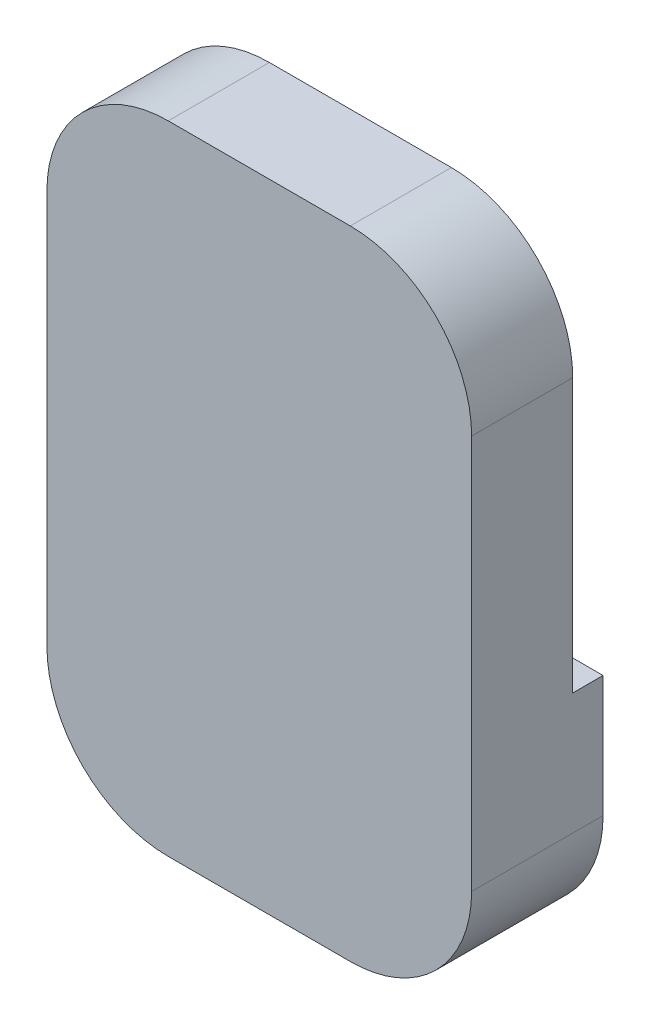
ISO-10303-21;
HEADER;
FILE_DESCRIPTION(('STEP AP214'),'2;1');
FILE_NAME('part.step','',(''),(''),'','','');
FILE_SCHEMA(('AUTOMOTIVE_DESIGN { 1 0 10303 214 1 1 1 1 }'));
ENDSEC;
DATA;
#1=APPLICATION_CONTEXT('core data for automotive mechanical design processes');
#2=APPLICATION_PROTOCOL_DEFINITION('international standard','automotive_design',2000,#1);
#3=PRODUCT_CONTEXT('',#1,'mechanical');
#4=PRODUCT('Part','Part','',(#3));
#5=PRODUCT_RELATED_PRODUCT_CATEGORY('part','',(#4));
#6=PRODUCT_DEFINITION_FORMATION('','',#4);
#7=PRODUCT_DEFINITION_CONTEXT('part definition',#1,'design');
#8=PRODUCT_DEFINITION('design','',#6,#7);
#9=PRODUCT_DEFINITION_SHAPE('','',#8);
#10=(LENGTH_UNIT() NAMED_UNIT(*) SI_UNIT(.MILLI.,.METRE.));
#11=(NAMED_UNIT(*) PLANE_ANGLE_UNIT() SI_UNIT($,.RADIAN.));
#12=(NAMED_UNIT(*) SI_UNIT($,.STERADIAN.) SOLID_ANGLE_UNIT());
#13=UNCERTAINTY_MEASURE_WITH_UNIT(LENGTH_MEASURE(1.E-05),#10,'distance_accuracy_value','');
#14=(GEOMETRIC_REPRESENTATION_CONTEXT(3) GLOBAL_UNCERTAINTY_ASSIGNED_CONTEXT((#13)) GLOBAL_UNIT_ASSIGNED_CONTEXT((#10,
#11,#12)) REPRESENTATION_CONTEXT('',''));
#15=CARTESIAN_POINT('',(0.,0.,0.));
#16=DIRECTION('',(0.,0.,1.));
#17=DIRECTION('',(1.,0.,0.));
#18=AXIS2_PLACEMENT_3D('',#15,#16,#17);
#19=CARTESIAN_POINT('',(-21.,31.5,10.));
#20=DIRECTION('',(1.,0.,0.));
#21=DIRECTION('',(0.,1.,0.));
#22=AXIS2_PLACEMENT_3D('',#19,#20,#21);
#23=PLANE('',#22);
#24=DIRECTION('',(0.,1.,0.));
#25=VECTOR('',#24,1.);
#26=CARTESIAN_POINT('',(-21.,0.,-3.));
#27=LINE('',#26,#25);
#28=CARTESIAN_POINT('',(-21.,-19.5,-3.));
#29=VERTEX_POINT('',#28);
#30=CARTESIAN_POINT('',(-21.,-7.50000000000001,-3.));
#31=VERTEX_POINT('',#30);
#32=EDGE_CURVE('E324',#29,#31,#27,.T.);
#33=ORIENTED_EDGE('',*,*,#32,.F.);
#34=DIRECTION('',(0.,0.,-1.));
#35=VECTOR('',#34,1.);
#36=CARTESIAN_POINT('',(-21.,-19.5,10.));
#37=LINE('',#36,#35);
#38=CARTESIAN_POINT('',(-21.,-19.5,10.));
#39=VERTEX_POINT('',#38);
#40=EDGE_CURVE('E445',#29,#39,#37,.F.);
#41=ORIENTED_EDGE('',*,*,#40,.T.);
#42=DIRECTION('',(0.,-1.,0.));
#43=VECTOR('',#42,1.);
#44=CARTESIAN_POINT('',(-21.,31.5,10.));
#45=LINE('',#44,#43);
#46=CARTESIAN_POINT('',(-21.,19.5,10.));
#47=VERTEX_POINT('',#46);
#48=EDGE_CURVE('E412',#47,#39,#45,.T.);
#49=ORIENTED_EDGE('',*,*,#48,.F.);
#50=DIRECTION('',(0.,0.,-1.));
#51=VECTOR('',#50,1.);
#52=CARTESIAN_POINT('',(-21.,19.5,10.));
#53=LINE('',#52,#51);
#54=CARTESIAN_POINT('',(-21.,19.5,0.));
#55=VERTEX_POINT('',#54);
#56=EDGE_CURVE('E442',#47,#55,#53,.T.);
#57=ORIENTED_EDGE('',*,*,#56,.T.);
#58=DIRECTION('',(0.,-1.,0.));
#59=VECTOR('',#58,1.);
#60=CARTESIAN_POINT('',(-21.,31.5,0.));
#61=LINE('',#60,#59);
#62=CARTESIAN_POINT('',(-21.,-7.50000000000001,0.));
#63=VERTEX_POINT('',#62);
#64=EDGE_CURVE('E409',#55,#63,#61,.T.);
#65=ORIENTED_EDGE('',*,*,#64,.T.);
#66=DIRECTION('',(0.,0.,1.));
#67=VECTOR('',#66,1.);
#68=CARTESIAN_POINT('',(-21.,-7.50000000000001,-10.));
#69=LINE('',#68,#67);
#70=EDGE_CURVE('E401',#31,#63,#69,.T.);
#71=ORIENTED_EDGE('',*,*,#70,.F.);
#72=EDGE_LOOP('',(#33,#41,#49,#57,#65,#71));
#73=FACE_BOUND('',#72,.T.);
#74=ADVANCED_FACE('F147',(#73),#23,.F.);
#75=CARTESIAN_POINT('',(21.,-7.50000000000001,-10.));
#76=DIRECTION('',(0.,-1.,0.));
#77=DIRECTION('',(0.,0.,-1.));
#78=AXIS2_PLACEMENT_3D('',#75,#76,#77);
#79=PLANE('',#78);
#80=CARTESIAN_POINT('',(-1.27,-7.50000000000001,-6.25));
#81=DIRECTION('',(0.,1.,0.));
#82=DIRECTION('',(0.,0.,1.));
#83=AXIS2_PLACEMENT_3D('',#80,#81,#82);
#84=CIRCLE('',#83,0.74);
#85=CARTESIAN_POINT('',(-1.27,-7.50000000000001,-5.51));
#86=VERTEX_POINT('',#85);
#87=EDGE_CURVE('E355',#86,#86,#84,.T.);
#88=ORIENTED_EDGE('',*,*,#87,.F.);
#89=EDGE_LOOP('',(#88));
#90=FACE_BOUND('',#89,.T.);
#91=CARTESIAN_POINT('',(3.81,-7.50000000000001,-6.25000000000002));
#92=DIRECTION('',(0.,1.,0.));
#93=DIRECTION('',(0.,0.,1.));
#94=AXIS2_PLACEMENT_3D('',#91,#92,#93);
#95=CIRCLE('',#94,0.74);
#96=CARTESIAN_POINT('',(3.81,-7.50000000000001,-5.51000000000002));
#97=VERTEX_POINT('',#96);
#98=EDGE_CURVE('E349',#97,#97,#95,.T.);
#99=ORIENTED_EDGE('',*,*,#98,.F.);
#100=EDGE_LOOP('',(#99));
#101=FACE_BOUND('',#100,.T.);
#102=CARTESIAN_POINT('',(1.27,-7.50000000000001,-6.25000000000002));
#103=DIRECTION('',(0.,1.,0.));
#104=DIRECTION('',(0.,0.,1.));
#105=AXIS2_PLACEMENT_3D('',#102,#103,#104);
#106=CIRCLE('',#105,0.74);
#107=CARTESIAN_POINT('',(1.27,-7.50000000000001,-5.51000000000002));
#108=VERTEX_POINT('',#107);
#109=EDGE_CURVE('E343',#108,#108,#106,.T.);
#110=ORIENTED_EDGE('',*,*,#109,.F.);
#111=EDGE_LOOP('',(#110));
#112=FACE_BOUND('',#111,.T.);
#113=CARTESIAN_POINT('',(-3.81,-7.50000000000001,-6.24999999999998));
#114=DIRECTION('',(0.,1.,0.));
#115=DIRECTION('',(0.,0.,1.));
#116=AXIS2_PLACEMENT_3D('',#113,#114,#115);
#117=CIRCLE('',#116,0.74);
#118=CARTESIAN_POINT('',(-3.81,-7.50000000000001,-5.50999999999998));
#119=VERTEX_POINT('',#118);
#120=EDGE_CURVE('E340',#119,#119,#117,.T.);
#121=ORIENTED_EDGE('',*,*,#120,.F.);
#122=EDGE_LOOP('',(#121));
#123=FACE_BOUND('',#122,.T.);
#124=DIRECTION('',(0.,0.,-1.));
#125=VECTOR('',#124,1.);
#126=CARTESIAN_POINT('',(-6.55000000000001,-7.50000000000001,-3.));
#127=LINE('',#126,#125);
#128=CARTESIAN_POINT('',(-6.55000000000001,-7.50000000000001,-3.));
#129=VERTEX_POINT('',#128);
#130=CARTESIAN_POINT('',(-6.55000000000001,-7.50000000000001,-10.));
#131=VERTEX_POINT('',#130);
#132=EDGE_CURVE('E317',#129,#131,#127,.T.);
#133=ORIENTED_EDGE('',*,*,#132,.F.);
#134=DIRECTION('',(1.,0.,0.));
#135=VECTOR('',#134,1.);
#136=CARTESIAN_POINT('',(0.,-7.50000000000001,-3.));
#137=LINE('',#136,#135);
#138=EDGE_CURVE('E316',#31,#129,#137,.T.);
#139=ORIENTED_EDGE('',*,*,#138,.F.);
#140=ORIENTED_EDGE('',*,*,#70,.T.);
#141=DIRECTION('',(1.,0.,0.));
#142=VECTOR('',#141,1.);
#143=CARTESIAN_POINT('',(21.,-7.50000000000001,0.));
#144=LINE('',#143,#142);
#145=CARTESIAN_POINT('',(-3.5,-7.50000000000001,0.));
#146=VERTEX_POINT('',#145);
#147=EDGE_CURVE('E395',#63,#146,#144,.T.);
#148=ORIENTED_EDGE('',*,*,#147,.T.);
#149=DIRECTION('',(0.55470019622523,0.,0.832050294337843));
#150=VECTOR('',#149,1.);
#151=CARTESIAN_POINT('',(-2.42307692307692,-7.50000000000001,1.61538461538461));
#152=LINE('',#151,#150);
#153=CARTESIAN_POINT('',(-5.5,-7.50000000000001,-3.));
#154=VERTEX_POINT('',#153);
#155=EDGE_CURVE('E364',#154,#146,#152,.T.);
#156=ORIENTED_EDGE('',*,*,#155,.F.);
#157=DIRECTION('',(-1.,0.,0.));
#158=VECTOR('',#157,1.);
#159=CARTESIAN_POINT('',(0.,-7.50000000000001,-3.));
#160=LINE('',#159,#158);
#161=CARTESIAN_POINT('',(5.5,-7.50000000000001,-3.));
#162=VERTEX_POINT('',#161);
#163=EDGE_CURVE('E374',#162,#154,#160,.T.);
#164=ORIENTED_EDGE('',*,*,#163,.F.);
#165=DIRECTION('',(-0.554700196225229,0.,0.832050294337844));
#166=VECTOR('',#165,1.);
#167=CARTESIAN_POINT('',(2.42307692307692,-7.50000000000001,1.61538461538461));
#168=LINE('',#167,#166);
#169=CARTESIAN_POINT('',(3.5,-7.50000000000001,0.));
#170=VERTEX_POINT('',#169);
#171=EDGE_CURVE('E339',#162,#170,#168,.T.);
#172=ORIENTED_EDGE('',*,*,#171,.T.);
#173=CARTESIAN_POINT('',(21.,-7.50000000000001,0.));
#174=VERTEX_POINT('',#173);
#175=EDGE_CURVE('E390',#170,#174,#144,.T.);
#176=ORIENTED_EDGE('',*,*,#175,.T.);
#177=DIRECTION('',(0.,0.,1.));
#178=VECTOR('',#177,1.);
#179=CARTESIAN_POINT('',(21.,-7.50000000000001,-10.));
#180=LINE('',#179,#178);
#181=CARTESIAN_POINT('',(21.,-7.50000000000001,-3.));
#182=VERTEX_POINT('',#181);
#183=EDGE_CURVE('E398',#182,#174,#180,.T.);
#184=ORIENTED_EDGE('',*,*,#183,.F.);
#185=CARTESIAN_POINT('',(6.55000000000001,-7.50000000000001,-3.));
#186=VERTEX_POINT('',#185);
#187=EDGE_CURVE('E321',#186,#182,#137,.T.);
#188=ORIENTED_EDGE('',*,*,#187,.F.);
#189=DIRECTION('',(0.,0.,-1.));
#190=VECTOR('',#189,1.);
#191=CARTESIAN_POINT('',(6.55000000000001,-7.50000000000001,-3.));
#192=LINE('',#191,#190);
#193=CARTESIAN_POINT('',(6.55000000000001,-7.50000000000001,-10.));
#194=VERTEX_POINT('',#193);
#195=EDGE_CURVE('E526',#186,#194,#192,.T.);
#196=ORIENTED_EDGE('',*,*,#195,.T.);
#197=DIRECTION('',(1.,0.,0.));
#198=VECTOR('',#197,1.);
#199=CARTESIAN_POINT('',(21.,-7.50000000000001,-10.));
#200=LINE('',#199,#198);
#201=EDGE_CURVE('E394',#131,#194,#200,.T.);
#202=ORIENTED_EDGE('',*,*,#201,.F.);
#203=EDGE_LOOP('',(#133,#139,#140,#148,#156,#164,#172,#176,#184,#188,#196,#202));
#204=FACE_BOUND('',#203,.T.);
#205=ADVANCED_FACE('F569',(#90,#101,#112,#123,#204),#79,.F.);
#206=CARTESIAN_POINT('',(0.,0.,-10.));
#207=DIRECTION('',(0.,0.,1.));
#208=DIRECTION('',(1.,0.,0.));
#209=AXIS2_PLACEMENT_3D('',#206,#207,#208);
#210=PLANE('',#209);
#211=DIRECTION('',(-1.,0.,0.));
#212=VECTOR('',#211,1.);
#213=CARTESIAN_POINT('',(0.,-23.5,-10.));
#214=LINE('',#213,#212);
#215=CARTESIAN_POINT('',(7.55000000000001,-23.5,-10.));
#216=VERTEX_POINT('',#215);
#217=CARTESIAN_POINT('',(-7.55000000000001,-23.5,-10.));
#218=VERTEX_POINT('',#217);
#219=EDGE_CURVE('E332',#216,#218,#214,.T.);
#220=ORIENTED_EDGE('',*,*,#219,.T.);
#221=DIRECTION('',(-0.0623782861551805,-0.998052578482889,0.));
#222=VECTOR('',#221,1.);
#223=CARTESIAN_POINT('',(-6.55000000000001,-7.50000000000001,-10.));
#224=LINE('',#223,#222);
#225=EDGE_CURVE('E302',#131,#218,#224,.T.);
#226=ORIENTED_EDGE('',*,*,#225,.F.);
#227=ORIENTED_EDGE('',*,*,#201,.T.);
#228=DIRECTION('',(0.0623782861551805,-0.998052578482889,0.));
#229=VECTOR('',#228,1.);
#230=CARTESIAN_POINT('',(6.55000000000001,-7.50000000000001,-10.));
#231=LINE('',#230,#229);
#232=EDGE_CURVE('E530',#194,#216,#231,.T.);
#233=ORIENTED_EDGE('',*,*,#232,.T.);
#234=EDGE_LOOP('',(#220,#226,#227,#233));
#235=FACE_BOUND('',#234,.T.);
#236=ADVANCED_FACE('F566',(#235),#210,.F.);
#237=CARTESIAN_POINT('',(21.,31.5,10.));
#238=DIRECTION('',(-1.,0.,0.));
#239=DIRECTION('',(0.,-1.,0.));
#240=AXIS2_PLACEMENT_3D('',#237,#238,#239);
#241=PLANE('',#240);
#242=DIRECTION('',(0.,0.,-1.));
#243=VECTOR('',#242,1.);
#244=CARTESIAN_POINT('',(21.,-19.5,10.));
#245=LINE('',#244,#243);
#246=CARTESIAN_POINT('',(21.,-19.5,10.));
#247=VERTEX_POINT('',#246);
#248=CARTESIAN_POINT('',(21.,-19.5,-3.));
#249=VERTEX_POINT('',#248);
#250=EDGE_CURVE('E426',#247,#249,#245,.T.);
#251=ORIENTED_EDGE('',*,*,#250,.T.);
#252=DIRECTION('',(0.,-1.,0.));
#253=VECTOR('',#252,1.);
#254=CARTESIAN_POINT('',(21.,0.,-3.));
#255=LINE('',#254,#253);
#256=EDGE_CURVE('E170',#182,#249,#255,.T.);
#257=ORIENTED_EDGE('',*,*,#256,.F.);
#258=ORIENTED_EDGE('',*,*,#183,.T.);
#259=DIRECTION('',(0.,1.,0.));
#260=VECTOR('',#259,1.);
#261=CARTESIAN_POINT('',(21.,31.5,0.));
#262=LINE('',#261,#260);
#263=CARTESIAN_POINT('',(21.,19.5,0.));
#264=VERTEX_POINT('',#263);
#265=EDGE_CURVE('E404',#174,#264,#262,.T.);
#266=ORIENTED_EDGE('',*,*,#265,.T.);
#267=DIRECTION('',(0.,0.,-1.));
#268=VECTOR('',#267,1.);
#269=CARTESIAN_POINT('',(21.,19.5,10.));
#270=LINE('',#269,#268);
#271=CARTESIAN_POINT('',(21.,19.5,10.));
#272=VERTEX_POINT('',#271);
#273=EDGE_CURVE('E418',#264,#272,#270,.F.);
#274=ORIENTED_EDGE('',*,*,#273,.T.);
#275=DIRECTION('',(0.,1.,0.));
#276=VECTOR('',#275,1.);
#277=CARTESIAN_POINT('',(21.,31.5,10.));
#278=LINE('',#277,#276);
#279=EDGE_CURVE('E405',#247,#272,#278,.T.);
#280=ORIENTED_EDGE('',*,*,#279,.F.);
#281=EDGE_LOOP('',(#251,#257,#258,#266,#274,#280));
#282=FACE_BOUND('',#281,.T.);
#283=ADVANCED_FACE('F477',(#282),#241,.F.);
#284=CARTESIAN_POINT('',(-21.,-31.5,10.));
#285=DIRECTION('',(0.,1.,0.));
#286=DIRECTION('',(0.,0.,1.));
#287=AXIS2_PLACEMENT_3D('',#284,#285,#286);
#288=PLANE('',#287);
#289=DIRECTION('',(-1.,0.,0.));
#290=VECTOR('',#289,1.);
#291=CARTESIAN_POINT('',(0.,-31.5,-3.));
#292=LINE('',#291,#290);
#293=CARTESIAN_POINT('',(-7.55000000000001,-31.5,-3.));
#294=VERTEX_POINT('',#293);
#295=CARTESIAN_POINT('',(-8.99999999999999,-31.5,-3.));
#296=VERTEX_POINT('',#295);
#297=EDGE_CURVE('E308',#294,#296,#292,.T.);
#298=ORIENTED_EDGE('',*,*,#297,.F.);
#299=DIRECTION('',(0.,0.,-1.));
#300=VECTOR('',#299,1.);
#301=CARTESIAN_POINT('',(-7.55000000000001,-31.5,-3.));
#302=LINE('',#301,#300);
#303=CARTESIAN_POINT('',(-7.55000000000001,-31.5,-10.));
#304=VERTEX_POINT('',#303);
#305=EDGE_CURVE('E307',#294,#304,#302,.T.);
#306=ORIENTED_EDGE('',*,*,#305,.T.);
#307=DIRECTION('',(-1.,0.,0.));
#308=VECTOR('',#307,1.);
#309=CARTESIAN_POINT('',(21.,-31.5,-10.));
#310=LINE('',#309,#308);
#311=CARTESIAN_POINT('',(7.55000000000001,-31.5,-10.));
#312=VERTEX_POINT('',#311);
#313=EDGE_CURVE('E391',#312,#304,#310,.T.);
#314=ORIENTED_EDGE('',*,*,#313,.F.);
#315=DIRECTION('',(0.,0.,-1.));
#316=VECTOR('',#315,1.);
#317=CARTESIAN_POINT('',(7.55000000000001,-31.5,-3.));
#318=LINE('',#317,#316);
#319=CARTESIAN_POINT('',(7.55000000000001,-31.5,-3.));
#320=VERTEX_POINT('',#319);
#321=EDGE_CURVE('E523',#320,#312,#318,.T.);
#322=ORIENTED_EDGE('',*,*,#321,.F.);
#323=DIRECTION('',(1.,0.,0.));
#324=VECTOR('',#323,1.);
#325=CARTESIAN_POINT('',(0.,-31.5,-3.));
#326=LINE('',#325,#324);
#327=CARTESIAN_POINT('',(9.00000000000001,-31.5,-3.));
#328=VERTEX_POINT('',#327);
#329=EDGE_CURVE('E518',#320,#328,#326,.T.);
#330=ORIENTED_EDGE('',*,*,#329,.T.);
#331=DIRECTION('',(0.,0.,-1.));
#332=VECTOR('',#331,1.);
#333=CARTESIAN_POINT('',(9.00000000000001,-31.5,10.));
#334=LINE('',#333,#332);
#335=CARTESIAN_POINT('',(9.,-31.5,10.));
#336=VERTEX_POINT('',#335);
#337=EDGE_CURVE('E432',#328,#336,#334,.F.);
#338=ORIENTED_EDGE('',*,*,#337,.T.);
#339=DIRECTION('',(1.,0.,0.));
#340=VECTOR('',#339,1.);
#341=CARTESIAN_POINT('',(-21.,-31.5,10.));
#342=LINE('',#341,#340);
#343=CARTESIAN_POINT('',(-9.,-31.5,10.));
#344=VERTEX_POINT('',#343);
#345=EDGE_CURVE('E415',#344,#336,#342,.T.);
#346=ORIENTED_EDGE('',*,*,#345,.F.);
#347=DIRECTION('',(0.,0.,-1.));
#348=VECTOR('',#347,1.);
#349=CARTESIAN_POINT('',(-8.99999999999999,-31.5,10.));
#350=LINE('',#349,#348);
#351=EDGE_CURVE('E429',#344,#296,#350,.T.);
#352=ORIENTED_EDGE('',*,*,#351,.T.);
#353=EDGE_LOOP('',(#298,#306,#314,#322,#330,#338,#346,#352));
#354=FACE_BOUND('',#353,.T.);
#355=ADVANCED_FACE('F465',(#354),#288,.F.);
#356=ORIENTED_EDGE('',*,*,#313,.T.);
#357=DIRECTION('',(0.,-1.,0.));
#358=VECTOR('',#357,1.);
#359=CARTESIAN_POINT('',(-7.55000000000001,0.,-10.));
#360=LINE('',#359,#358);
#361=CARTESIAN_POINT('',(-7.55000000000001,-29.5,-10.));
#362=VERTEX_POINT('',#361);
#363=EDGE_CURVE('E536',#362,#304,#360,.T.);
#364=ORIENTED_EDGE('',*,*,#363,.F.);
#365=DIRECTION('',(-1.,0.,0.));
#366=VECTOR('',#365,1.);
#367=CARTESIAN_POINT('',(0.,-29.5,-10.));
#368=LINE('',#367,#366);
#369=CARTESIAN_POINT('',(7.55000000000001,-29.5,-10.));
#370=VERTEX_POINT('',#369);
#371=EDGE_CURVE('E329',#370,#362,#368,.T.);
#372=ORIENTED_EDGE('',*,*,#371,.F.);
#373=DIRECTION('',(0.,-1.,0.));
#374=VECTOR('',#373,1.);
#375=CARTESIAN_POINT('',(7.55000000000001,0.,-10.));
#376=LINE('',#375,#374);
#377=EDGE_CURVE('E520',#370,#312,#376,.T.);
#378=ORIENTED_EDGE('',*,*,#377,.T.);
#379=EDGE_LOOP('',(#356,#364,#372,#378));
#380=FACE_BOUND('',#379,.T.);
#381=ADVANCED_FACE('F551',(#380),#210,.F.);
#382=CARTESIAN_POINT('',(0.,-29.5,-3.));
#383=DIRECTION('',(0.,-1.,0.));
#384=DIRECTION('',(1.,0.,0.));
#385=AXIS2_PLACEMENT_3D('',#382,#383,#384);
#386=PLANE('',#385);
#387=ORIENTED_EDGE('',*,*,#371,.T.);
#388=DIRECTION('',(0.,0.,1.));
#389=VECTOR('',#388,1.);
#390=CARTESIAN_POINT('',(-7.55000000000001,-29.5,-3.));
#391=LINE('',#390,#389);
#392=CARTESIAN_POINT('',(-7.55000000000001,-29.5,-3.));
#393=VERTEX_POINT('',#392);
#394=EDGE_CURVE('E506',#362,#393,#391,.T.);
#395=ORIENTED_EDGE('',*,*,#394,.T.);
#396=DIRECTION('',(-1.,0.,0.));
#397=VECTOR('',#396,1.);
#398=CARTESIAN_POINT('',(0.,-29.5,-3.));
#399=LINE('',#398,#397);
#400=CARTESIAN_POINT('',(7.55000000000001,-29.5,-3.));
#401=VERTEX_POINT('',#400);
#402=EDGE_CURVE('E335',#401,#393,#399,.T.);
#403=ORIENTED_EDGE('',*,*,#402,.F.);
#404=DIRECTION('',(0.,0.,1.));
#405=VECTOR('',#404,1.);
#406=CARTESIAN_POINT('',(7.55000000000001,-29.5,-3.));
#407=LINE('',#406,#405);
#408=EDGE_CURVE('E516',#370,#401,#407,.T.);
#409=ORIENTED_EDGE('',*,*,#408,.F.);
#410=EDGE_LOOP('',(#387,#395,#403,#409));
#411=FACE_BOUND('',#410,.T.);
#412=ADVANCED_FACE('F557',(#411),#386,.F.);
#413=CARTESIAN_POINT('',(0.,-23.5,-3.));
#414=DIRECTION('',(0.,-1.,0.));
#415=DIRECTION('',(1.,0.,0.));
#416=AXIS2_PLACEMENT_3D('',#413,#414,#415);
#417=PLANE('',#416);
#418=DIRECTION('',(0.,0.,-1.));
#419=VECTOR('',#418,1.);
#420=CARTESIAN_POINT('',(-7.55000000000001,-23.5,-3.));
#421=LINE('',#420,#419);
#422=CARTESIAN_POINT('',(-7.55000000000001,-23.5,-3.));
#423=VERTEX_POINT('',#422);
#424=EDGE_CURVE('E296',#423,#218,#421,.T.);
#425=ORIENTED_EDGE('',*,*,#424,.T.);
#426=ORIENTED_EDGE('',*,*,#219,.F.);
#427=DIRECTION('',(0.,0.,-1.));
#428=VECTOR('',#427,1.);
#429=CARTESIAN_POINT('',(7.55000000000001,-23.5,-3.));
#430=LINE('',#429,#428);
#431=CARTESIAN_POINT('',(7.55000000000001,-23.5,-3.));
#432=VERTEX_POINT('',#431);
#433=EDGE_CURVE('E320',#432,#216,#430,.T.);
#434=ORIENTED_EDGE('',*,*,#433,.F.);
#435=DIRECTION('',(-1.,0.,0.));
#436=VECTOR('',#435,1.);
#437=CARTESIAN_POINT('',(0.,-23.5,-3.));
#438=LINE('',#437,#436);
#439=EDGE_CURVE('E314',#432,#423,#438,.T.);
#440=ORIENTED_EDGE('',*,*,#439,.T.);
#441=EDGE_LOOP('',(#425,#426,#434,#440));
#442=FACE_BOUND('',#441,.T.);
#443=ADVANCED_FACE('F319',(#442),#417,.T.);
#444=CARTESIAN_POINT('',(9.00000000000001,-19.5,10.));
#445=DIRECTION('',(0.,0.,-1.));
#446=DIRECTION('',(-1.,0.,0.));
#447=AXIS2_PLACEMENT_3D('',#444,#445,#446);
#448=CYLINDRICAL_SURFACE('',#447,12.);
#449=ORIENTED_EDGE('',*,*,#337,.F.);
#450=CARTESIAN_POINT('',(9.00000000000001,-19.5,-3.));
#451=DIRECTION('',(0.,0.,-1.));
#452=DIRECTION('',(-1.,0.,0.));
#453=AXIS2_PLACEMENT_3D('',#450,#451,#452);
#454=CIRCLE('',#453,12.);
#455=EDGE_CURVE('E12',#328,#249,#454,.F.);
#456=ORIENTED_EDGE('',*,*,#455,.T.);
#457=ORIENTED_EDGE('',*,*,#250,.F.);
#458=CARTESIAN_POINT('',(9.00000000000001,-19.5,10.));
#459=DIRECTION('',(0.,0.,1.));
#460=DIRECTION('',(1.,0.,0.));
#461=AXIS2_PLACEMENT_3D('',#458,#459,#460);
#462=CIRCLE('',#461,12.);
#463=EDGE_CURVE('E440',#336,#247,#462,.T.);
#464=ORIENTED_EDGE('',*,*,#463,.F.);
#465=EDGE_LOOP('',(#449,#456,#457,#464));
#466=FACE_BOUND('',#465,.T.);
#467=ADVANCED_FACE('F475',(#466),#448,.T.);
#468=CARTESIAN_POINT('',(-8.99999999999999,-19.5,10.));
#469=DIRECTION('',(0.,0.,-1.));
#470=DIRECTION('',(-1.,0.,0.));
#471=AXIS2_PLACEMENT_3D('',#468,#469,#470);
#472=CYLINDRICAL_SURFACE('',#471,12.);
#473=ORIENTED_EDGE('',*,*,#40,.F.);
#474=CARTESIAN_POINT('',(-8.99999999999999,-19.5,-3.));
#475=DIRECTION('',(0.,0.,-1.));
#476=DIRECTION('',(-1.,0.,0.));
#477=AXIS2_PLACEMENT_3D('',#474,#475,#476);
#478=CIRCLE('',#477,12.);
#479=EDGE_CURVE('E155',#29,#296,#478,.F.);
#480=ORIENTED_EDGE('',*,*,#479,.T.);
#481=ORIENTED_EDGE('',*,*,#351,.F.);
#482=CARTESIAN_POINT('',(-8.99999999999999,-19.5,10.));
#483=DIRECTION('',(0.,0.,1.));
#484=DIRECTION('',(1.,0.,0.));
#485=AXIS2_PLACEMENT_3D('',#482,#483,#484);
#486=CIRCLE('',#485,12.);
#487=EDGE_CURVE('E438',#39,#344,#486,.T.);
#488=ORIENTED_EDGE('',*,*,#487,.F.);
#489=EDGE_LOOP('',(#473,#480,#481,#488));
#490=FACE_BOUND('',#489,.T.);
#491=ADVANCED_FACE('F460',(#490),#472,.T.);
#492=CARTESIAN_POINT('',(0.,0.,0.));
#493=DIRECTION('',(0.,0.,1.));
#494=DIRECTION('',(1.,0.,0.));
#495=AXIS2_PLACEMENT_3D('',#492,#493,#494);
#496=PLANE('',#495);
#497=ORIENTED_EDGE('',*,*,#64,.F.);
#498=CARTESIAN_POINT('',(-9.,19.5,0.));
#499=DIRECTION('',(0.,0.,1.));
#500=DIRECTION('',(1.,0.,0.));
#501=AXIS2_PLACEMENT_3D('',#498,#499,#500);
#502=CIRCLE('',#501,12.);
#503=CARTESIAN_POINT('',(-9.,31.5,0.));
#504=VERTEX_POINT('',#503);
#505=EDGE_CURVE('E449',#55,#504,#502,.F.);
#506=ORIENTED_EDGE('',*,*,#505,.T.);
#507=DIRECTION('',(-1.,0.,0.));
#508=VECTOR('',#507,1.);
#509=CARTESIAN_POINT('',(-21.,31.5,0.));
#510=LINE('',#509,#508);
#511=CARTESIAN_POINT('',(9.,31.5,0.));
#512=VERTEX_POINT('',#511);
#513=EDGE_CURVE('E421',#512,#504,#510,.T.);
#514=ORIENTED_EDGE('',*,*,#513,.F.);
#515=CARTESIAN_POINT('',(9.00000000000001,19.5,0.));
#516=DIRECTION('',(0.,0.,1.));
#517=DIRECTION('',(1.,0.,0.));
#518=AXIS2_PLACEMENT_3D('',#515,#516,#517);
#519=CIRCLE('',#518,12.);
#520=EDGE_CURVE('E447',#512,#264,#519,.F.);
#521=ORIENTED_EDGE('',*,*,#520,.T.);
#522=ORIENTED_EDGE('',*,*,#265,.F.);
#523=ORIENTED_EDGE('',*,*,#175,.F.);
#524=DIRECTION('',(0.,-1.,0.));
#525=VECTOR('',#524,1.);
#526=CARTESIAN_POINT('',(3.5,24.5,0.));
#527=LINE('',#526,#525);
#528=CARTESIAN_POINT('',(3.5,24.5,0.));
#529=VERTEX_POINT('',#528);
#530=EDGE_CURVE('E387',#529,#170,#527,.T.);
#531=ORIENTED_EDGE('',*,*,#530,.F.);
#532=DIRECTION('',(1.,0.,0.));
#533=VECTOR('',#532,1.);
#534=CARTESIAN_POINT('',(0.,24.5,0.));
#535=LINE('',#534,#533);
#536=CARTESIAN_POINT('',(-3.5,24.5,0.));
#537=VERTEX_POINT('',#536);
#538=EDGE_CURVE('E360',#537,#529,#535,.T.);
#539=ORIENTED_EDGE('',*,*,#538,.F.);
#540=DIRECTION('',(0.,-1.,0.));
#541=VECTOR('',#540,1.);
#542=CARTESIAN_POINT('',(-3.5,24.5,0.));
#543=LINE('',#542,#541);
#544=EDGE_CURVE('E372',#537,#146,#543,.T.);
#545=ORIENTED_EDGE('',*,*,#544,.T.);
#546=ORIENTED_EDGE('',*,*,#147,.F.);
#547=EDGE_LOOP('',(#497,#506,#514,#521,#522,#523,#531,#539,#545,#546));
#548=FACE_BOUND('',#547,.T.);
#549=ADVANCED_FACE('F490',(#548),#496,.F.);
#550=CARTESIAN_POINT('',(-21.,31.5,10.));
#551=DIRECTION('',(0.,-1.,0.));
#552=DIRECTION('',(0.,0.,-1.));
#553=AXIS2_PLACEMENT_3D('',#550,#551,#552);
#554=PLANE('',#553);
#555=ORIENTED_EDGE('',*,*,#513,.T.);
#556=DIRECTION('',(0.,0.,-1.));
#557=VECTOR('',#556,1.);
#558=CARTESIAN_POINT('',(-9.,31.5,10.));
#559=LINE('',#558,#557);
#560=CARTESIAN_POINT('',(-9.,31.5,10.));
#561=VERTEX_POINT('',#560);
#562=EDGE_CURVE('E454',#504,#561,#559,.F.);
#563=ORIENTED_EDGE('',*,*,#562,.T.);
#564=DIRECTION('',(-1.,0.,0.));
#565=VECTOR('',#564,1.);
#566=CARTESIAN_POINT('',(-21.,31.5,10.));
#567=LINE('',#566,#565);
#568=CARTESIAN_POINT('',(9.,31.5,10.));
#569=VERTEX_POINT('',#568);
#570=EDGE_CURVE('E408',#569,#561,#567,.T.);
#571=ORIENTED_EDGE('',*,*,#570,.F.);
#572=DIRECTION('',(0.,0.,-1.));
#573=VECTOR('',#572,1.);
#574=CARTESIAN_POINT('',(9.00000000000001,31.5,10.));
#575=LINE('',#574,#573);
#576=EDGE_CURVE('E451',#569,#512,#575,.T.);
#577=ORIENTED_EDGE('',*,*,#576,.T.);
#578=EDGE_LOOP('',(#555,#563,#571,#577));
#579=FACE_BOUND('',#578,.T.);
#580=ADVANCED_FACE('F486',(#579),#554,.F.);
#581=CARTESIAN_POINT('',(0.,0.,10.));
#582=DIRECTION('',(0.,0.,1.));
#583=DIRECTION('',(1.,0.,0.));
#584=AXIS2_PLACEMENT_3D('',#581,#582,#583);
#585=PLANE('',#584);
#586=ORIENTED_EDGE('',*,*,#345,.T.);
#587=ORIENTED_EDGE('',*,*,#463,.T.);
#588=ORIENTED_EDGE('',*,*,#279,.T.);
#589=CARTESIAN_POINT('',(9.00000000000001,19.5,10.));
#590=DIRECTION('',(0.,0.,1.));
#591=DIRECTION('',(1.,0.,0.));
#592=AXIS2_PLACEMENT_3D('',#589,#590,#591);
#593=CIRCLE('',#592,12.);
#594=EDGE_CURVE('E434',#272,#569,#593,.T.);
#595=ORIENTED_EDGE('',*,*,#594,.T.);
#596=ORIENTED_EDGE('',*,*,#570,.T.);
#597=CARTESIAN_POINT('',(-9.,19.5,10.));
#598=DIRECTION('',(0.,0.,1.));
#599=DIRECTION('',(1.,0.,0.));
#600=AXIS2_PLACEMENT_3D('',#597,#598,#599);
#601=CIRCLE('',#600,12.);
#602=EDGE_CURVE('E436',#561,#47,#601,.T.);
#603=ORIENTED_EDGE('',*,*,#602,.T.);
#604=ORIENTED_EDGE('',*,*,#48,.T.);
#605=ORIENTED_EDGE('',*,*,#487,.T.);
#606=EDGE_LOOP('',(#586,#587,#588,#595,#596,#603,#604,#605));
#607=FACE_BOUND('',#606,.T.);
#608=ADVANCED_FACE('F471',(#607),#585,.T.);
#609=CARTESIAN_POINT('',(2.42307692307692,24.5,1.61538461538461));
#610=DIRECTION('',(0.832050294337844,0.,0.554700196225229));
#611=DIRECTION('',(0.554700196225229,0.,-0.832050294337844));
#612=AXIS2_PLACEMENT_3D('',#609,#610,#611);
#613=PLANE('',#612);
#614=ORIENTED_EDGE('',*,*,#171,.F.);
#615=DIRECTION('',(0.,-1.,0.));
#616=VECTOR('',#615,1.);
#617=CARTESIAN_POINT('',(5.5,24.5,-3.));
#618=LINE('',#617,#616);
#619=CARTESIAN_POINT('',(5.5,24.5,-3.));
#620=VERTEX_POINT('',#619);
#621=EDGE_CURVE('E384',#620,#162,#618,.T.);
#622=ORIENTED_EDGE('',*,*,#621,.F.);
#623=DIRECTION('',(-0.554700196225229,0.,0.832050294337844));
#624=VECTOR('',#623,1.);
#625=CARTESIAN_POINT('',(2.42307692307692,24.5,1.61538461538461));
#626=LINE('',#625,#624);
#627=EDGE_CURVE('E363',#620,#529,#626,.T.);
#628=ORIENTED_EDGE('',*,*,#627,.T.);
#629=ORIENTED_EDGE('',*,*,#530,.T.);
#630=EDGE_LOOP('',(#614,#622,#628,#629));
#631=FACE_BOUND('',#630,.T.);
#632=ADVANCED_FACE('F661',(#631),#613,.T.);
#633=CARTESIAN_POINT('',(0.,24.5,-3.));
#634=DIRECTION('',(0.,0.,1.));
#635=DIRECTION('',(1.,0.,0.));
#636=AXIS2_PLACEMENT_3D('',#633,#634,#635);
#637=PLANE('',#636);
#638=ORIENTED_EDGE('',*,*,#163,.T.);
#639=DIRECTION('',(0.,-1.,0.));
#640=VECTOR('',#639,1.);
#641=CARTESIAN_POINT('',(-5.5,24.5,-3.));
#642=LINE('',#641,#640);
#643=CARTESIAN_POINT('',(-5.5,24.5,-3.));
#644=VERTEX_POINT('',#643);
#645=EDGE_CURVE('E381',#644,#154,#642,.T.);
#646=ORIENTED_EDGE('',*,*,#645,.F.);
#647=DIRECTION('',(-1.,0.,0.));
#648=VECTOR('',#647,1.);
#649=CARTESIAN_POINT('',(0.,24.5,-3.));
#650=LINE('',#649,#648);
#651=EDGE_CURVE('E367',#620,#644,#650,.T.);
#652=ORIENTED_EDGE('',*,*,#651,.F.);
#653=ORIENTED_EDGE('',*,*,#621,.T.);
#654=EDGE_LOOP('',(#638,#646,#652,#653));
#655=FACE_BOUND('',#654,.T.);
#656=ADVANCED_FACE('F657',(#655),#637,.F.);
#657=CARTESIAN_POINT('',(-2.42307692307692,24.5,1.61538461538461));
#658=DIRECTION('',(0.832050294337843,0.,-0.55470019622523));
#659=DIRECTION('',(-0.55470019622523,0.,-0.832050294337843));
#660=AXIS2_PLACEMENT_3D('',#657,#658,#659);
#661=PLANE('',#660);
#662=ORIENTED_EDGE('',*,*,#155,.T.);
#663=ORIENTED_EDGE('',*,*,#544,.F.);
#664=DIRECTION('',(0.55470019622523,0.,0.832050294337843));
#665=VECTOR('',#664,1.);
#666=CARTESIAN_POINT('',(-2.42307692307692,24.5,1.61538461538461));
#667=LINE('',#666,#665);
#668=EDGE_CURVE('E369',#644,#537,#667,.T.);
#669=ORIENTED_EDGE('',*,*,#668,.F.);
#670=ORIENTED_EDGE('',*,*,#645,.T.);
#671=EDGE_LOOP('',(#662,#663,#669,#670));
#672=FACE_BOUND('',#671,.T.);
#673=ADVANCED_FACE('F653',(#672),#661,.F.);
#674=CARTESIAN_POINT('',(0.,24.5,0.));
#675=DIRECTION('',(0.,1.,0.));
#676=DIRECTION('',(0.,0.,1.));
#677=AXIS2_PLACEMENT_3D('',#674,#675,#676);
#678=PLANE('',#677);
#679=ORIENTED_EDGE('',*,*,#538,.T.);
#680=ORIENTED_EDGE('',*,*,#627,.F.);
#681=ORIENTED_EDGE('',*,*,#651,.T.);
#682=ORIENTED_EDGE('',*,*,#668,.T.);
#683=EDGE_LOOP('',(#679,#680,#681,#682));
#684=FACE_BOUND('',#683,.T.);
#685=ADVANCED_FACE('F646',(#684),#678,.T.);
#686=CARTESIAN_POINT('',(-1.27,-17.5,-6.25));
#687=DIRECTION('',(0.,1.,0.));
#688=DIRECTION('',(0.,0.,1.));
#689=AXIS2_PLACEMENT_3D('',#686,#687,#688);
#690=CYLINDRICAL_SURFACE('',#689,0.74);
#691=ORIENTED_EDGE('',*,*,#87,.T.);
#692=EDGE_LOOP('',(#691));
#693=FACE_BOUND('',#692,.T.);
#694=CARTESIAN_POINT('',(-1.27,-17.5,-6.25));
#695=DIRECTION('',(0.,1.,0.));
#696=DIRECTION('',(0.,0.,1.));
#697=AXIS2_PLACEMENT_3D('',#694,#695,#696);
#698=CIRCLE('',#697,0.74);
#699=CARTESIAN_POINT('',(-1.27,-17.5,-5.51));
#700=VERTEX_POINT('',#699);
#701=EDGE_CURVE('E328',#700,#700,#698,.T.);
#702=ORIENTED_EDGE('',*,*,#701,.F.);
#703=EDGE_LOOP('',(#702));
#704=FACE_BOUND('',#703,.T.);
#705=ADVANCED_FACE('F643',(#693,#704),#690,.F.);
#706=CARTESIAN_POINT('',(0.,-17.5,0.));
#707=DIRECTION('',(0.,1.,0.));
#708=DIRECTION('',(0.,0.,1.));
#709=AXIS2_PLACEMENT_3D('',#706,#707,#708);
#710=PLANE('',#709);
#711=ORIENTED_EDGE('',*,*,#701,.T.);
#712=EDGE_LOOP('',(#711));
#713=FACE_BOUND('',#712,.T.);
#714=ADVANCED_FACE('F638',(#713),#710,.T.);
#715=CARTESIAN_POINT('',(3.81,-17.5,-6.25000000000002));
#716=DIRECTION('',(0.,1.,0.));
#717=DIRECTION('',(0.,0.,1.));
#718=AXIS2_PLACEMENT_3D('',#715,#716,#717);
#719=CYLINDRICAL_SURFACE('',#718,0.74);
#720=CARTESIAN_POINT('',(3.81,-17.5,-6.25000000000002));
#721=DIRECTION('',(0.,1.,0.));
#722=DIRECTION('',(0.,0.,1.));
#723=AXIS2_PLACEMENT_3D('',#720,#721,#722);
#724=CIRCLE('',#723,0.74);
#725=CARTESIAN_POINT('',(3.81,-17.5,-5.51000000000002));
#726=VERTEX_POINT('',#725);
#727=EDGE_CURVE('E352',#726,#726,#724,.T.);
#728=ORIENTED_EDGE('',*,*,#727,.F.);
#729=EDGE_LOOP('',(#728));
#730=FACE_BOUND('',#729,.T.);
#731=ORIENTED_EDGE('',*,*,#98,.T.);
#732=EDGE_LOOP('',(#731));
#733=FACE_BOUND('',#732,.T.);
#734=ADVANCED_FACE('F635',(#730,#733),#719,.F.);
#735=CARTESIAN_POINT('',(0.,-17.5,0.));
#736=DIRECTION('',(0.,1.,0.));
#737=DIRECTION('',(0.,0.,1.));
#738=AXIS2_PLACEMENT_3D('',#735,#736,#737);
#739=PLANE('',#738);
#740=ORIENTED_EDGE('',*,*,#727,.T.);
#741=EDGE_LOOP('',(#740));
#742=FACE_BOUND('',#741,.T.);
#743=ADVANCED_FACE('F630',(#742),#739,.T.);
#744=CARTESIAN_POINT('',(1.27,-17.5,-6.25000000000002));
#745=DIRECTION('',(0.,1.,0.));
#746=DIRECTION('',(0.,0.,1.));
#747=AXIS2_PLACEMENT_3D('',#744,#745,#746);
#748=CYLINDRICAL_SURFACE('',#747,0.74);
#749=ORIENTED_EDGE('',*,*,#109,.T.);
#750=EDGE_LOOP('',(#749));
#751=FACE_BOUND('',#750,.T.);
#752=CARTESIAN_POINT('',(1.27,-17.5,-6.25000000000002));
#753=DIRECTION('',(0.,1.,0.));
#754=DIRECTION('',(0.,0.,1.));
#755=AXIS2_PLACEMENT_3D('',#752,#753,#754);
#756=CIRCLE('',#755,0.74);
#757=CARTESIAN_POINT('',(1.27,-17.5,-5.51000000000002));
#758=VERTEX_POINT('',#757);
#759=EDGE_CURVE('E346',#758,#758,#756,.T.);
#760=ORIENTED_EDGE('',*,*,#759,.F.);
#761=EDGE_LOOP('',(#760));
#762=FACE_BOUND('',#761,.T.);
#763=ADVANCED_FACE('F627',(#751,#762),#748,.F.);
#764=CARTESIAN_POINT('',(0.,-17.5,0.));
#765=DIRECTION('',(0.,1.,0.));
#766=DIRECTION('',(0.,0.,1.));
#767=AXIS2_PLACEMENT_3D('',#764,#765,#766);
#768=PLANE('',#767);
#769=ORIENTED_EDGE('',*,*,#759,.T.);
#770=EDGE_LOOP('',(#769));
#771=FACE_BOUND('',#770,.T.);
#772=ADVANCED_FACE('F623',(#771),#768,.T.);
#773=CARTESIAN_POINT('',(-3.81,-17.5,-6.24999999999998));
#774=DIRECTION('',(0.,1.,0.));
#775=DIRECTION('',(0.,0.,1.));
#776=AXIS2_PLACEMENT_3D('',#773,#774,#775);
#777=CYLINDRICAL_SURFACE('',#776,0.74);
#778=CARTESIAN_POINT('',(-3.81,-17.5,-6.24999999999998));
#779=DIRECTION('',(0.,1.,0.));
#780=DIRECTION('',(0.,0.,1.));
#781=AXIS2_PLACEMENT_3D('',#778,#779,#780);
#782=CIRCLE('',#781,0.74);
#783=CARTESIAN_POINT('',(-3.81,-17.5,-5.50999999999998));
#784=VERTEX_POINT('',#783);
#785=EDGE_CURVE('E336',#784,#784,#782,.T.);
#786=ORIENTED_EDGE('',*,*,#785,.F.);
#787=EDGE_LOOP('',(#786));
#788=FACE_BOUND('',#787,.T.);
#789=ORIENTED_EDGE('',*,*,#120,.T.);
#790=EDGE_LOOP('',(#789));
#791=FACE_BOUND('',#790,.T.);
#792=ADVANCED_FACE('F618',(#788,#791),#777,.F.);
#793=CARTESIAN_POINT('',(0.,-17.5,0.));
#794=DIRECTION('',(0.,1.,0.));
#795=DIRECTION('',(0.,0.,1.));
#796=AXIS2_PLACEMENT_3D('',#793,#794,#795);
#797=PLANE('',#796);
#798=ORIENTED_EDGE('',*,*,#785,.T.);
#799=EDGE_LOOP('',(#798));
#800=FACE_BOUND('',#799,.T.);
#801=ADVANCED_FACE('F614',(#800),#797,.T.);
#802=CARTESIAN_POINT('',(0.,0.,-3.));
#803=DIRECTION('',(0.,0.,-1.));
#804=DIRECTION('',(-1.,0.,0.));
#805=AXIS2_PLACEMENT_3D('',#802,#803,#804);
#806=PLANE('',#805);
#807=ORIENTED_EDGE('',*,*,#402,.T.);
#808=DIRECTION('',(0.,-1.,0.));
#809=VECTOR('',#808,1.);
#810=CARTESIAN_POINT('',(-7.55000000000001,0.,-3.));
#811=LINE('',#810,#809);
#812=EDGE_CURVE('E540',#393,#294,#811,.T.);
#813=ORIENTED_EDGE('',*,*,#812,.T.);
#814=ORIENTED_EDGE('',*,*,#297,.T.);
#815=ORIENTED_EDGE('',*,*,#479,.F.);
#816=ORIENTED_EDGE('',*,*,#32,.T.);
#817=ORIENTED_EDGE('',*,*,#138,.T.);
#818=DIRECTION('',(-0.0623782861551805,-0.998052578482889,0.));
#819=VECTOR('',#818,1.);
#820=CARTESIAN_POINT('',(-6.55000000000001,-7.50000000000001,-3.));
#821=LINE('',#820,#819);
#822=EDGE_CURVE('E299',#129,#423,#821,.T.);
#823=ORIENTED_EDGE('',*,*,#822,.T.);
#824=ORIENTED_EDGE('',*,*,#439,.F.);
#825=DIRECTION('',(0.0623782861551805,-0.998052578482889,0.));
#826=VECTOR('',#825,1.);
#827=CARTESIAN_POINT('',(6.55000000000001,-7.50000000000001,-3.));
#828=LINE('',#827,#826);
#829=EDGE_CURVE('E162',#186,#432,#828,.T.);
#830=ORIENTED_EDGE('',*,*,#829,.F.);
#831=ORIENTED_EDGE('',*,*,#187,.T.);
#832=ORIENTED_EDGE('',*,*,#256,.T.);
#833=ORIENTED_EDGE('',*,*,#455,.F.);
#834=ORIENTED_EDGE('',*,*,#329,.F.);
#835=DIRECTION('',(0.,-1.,0.));
#836=VECTOR('',#835,1.);
#837=CARTESIAN_POINT('',(7.55000000000001,0.,-3.));
#838=LINE('',#837,#836);
#839=EDGE_CURVE('E521',#401,#320,#838,.T.);
#840=ORIENTED_EDGE('',*,*,#839,.F.);
#841=EDGE_LOOP('',(#807,#813,#814,#815,#816,#817,#823,#824,#830,#831,#832,#833,#834,#840));
#842=FACE_BOUND('',#841,.T.);
#843=CARTESIAN_POINT('',(-5.99999999999998,-26.5,-3.));
#844=DIRECTION('',(0.,0.,-1.));
#845=DIRECTION('',(-1.,0.,0.));
#846=AXIS2_PLACEMENT_3D('',#843,#844,#845);
#847=CIRCLE('',#846,1.6);
#848=CARTESIAN_POINT('',(-7.59999999999998,-26.5,-3.));
#849=VERTEX_POINT('',#848);
#850=EDGE_CURVE('E509',#849,#849,#847,.T.);
#851=ORIENTED_EDGE('',*,*,#850,.F.);
#852=EDGE_LOOP('',(#851));
#853=FACE_BOUND('',#852,.T.);
#854=CARTESIAN_POINT('',(5.99999999999998,-26.5,-3.));
#855=DIRECTION('',(0.,0.,-1.));
#856=DIRECTION('',(-1.,0.,0.));
#857=AXIS2_PLACEMENT_3D('',#854,#855,#856);
#858=CIRCLE('',#857,1.6);
#859=CARTESIAN_POINT('',(4.39999999999998,-26.5,-3.));
#860=VERTEX_POINT('',#859);
#861=EDGE_CURVE('E505',#860,#860,#858,.T.);
#862=ORIENTED_EDGE('',*,*,#861,.F.);
#863=EDGE_LOOP('',(#862));
#864=FACE_BOUND('',#863,.T.);
#865=ADVANCED_FACE('F312',(#842,#853,#864),#806,.T.);
#866=CARTESIAN_POINT('',(5.99999999999998,-26.5,0.));
#867=DIRECTION('',(0.,0.,-1.));
#868=DIRECTION('',(-1.,0.,0.));
#869=AXIS2_PLACEMENT_3D('',#866,#867,#868);
#870=CYLINDRICAL_SURFACE('',#869,1.6);
#871=CARTESIAN_POINT('',(5.99999999999998,-26.5,0.));
#872=DIRECTION('',(0.,0.,-1.));
#873=DIRECTION('',(-1.,0.,0.));
#874=AXIS2_PLACEMENT_3D('',#871,#872,#873);
#875=CIRCLE('',#874,1.6);
#876=CARTESIAN_POINT('',(4.39999999999998,-26.5,0.));
#877=VERTEX_POINT('',#876);
#878=EDGE_CURVE('E502',#877,#877,#875,.T.);
#879=ORIENTED_EDGE('',*,*,#878,.F.);
#880=EDGE_LOOP('',(#879));
#881=FACE_BOUND('',#880,.T.);
#882=ORIENTED_EDGE('',*,*,#861,.T.);
#883=EDGE_LOOP('',(#882));
#884=FACE_BOUND('',#883,.T.);
#885=ADVANCED_FACE('F607',(#881,#884),#870,.F.);
#886=CARTESIAN_POINT('',(5.99999999999998,-26.5,0.));
#887=DIRECTION('',(0.,0.,-1.));
#888=DIRECTION('',(-1.,0.,0.));
#889=AXIS2_PLACEMENT_3D('',#886,#887,#888);
#890=PLANE('',#889);
#891=ORIENTED_EDGE('',*,*,#878,.T.);
#892=EDGE_LOOP('',(#891));
#893=FACE_BOUND('',#892,.T.);
#894=ADVANCED_FACE('F601',(#893),#890,.T.);
#895=CARTESIAN_POINT('',(-5.99999999999998,-26.5,0.));
#896=DIRECTION('',(0.,0.,-1.));
#897=DIRECTION('',(-1.,0.,0.));
#898=AXIS2_PLACEMENT_3D('',#895,#896,#897);
#899=CYLINDRICAL_SURFACE('',#898,1.6);
#900=CARTESIAN_POINT('',(-5.99999999999998,-26.5,0.));
#901=DIRECTION('',(0.,0.,-1.));
#902=DIRECTION('',(-1.,0.,0.));
#903=AXIS2_PLACEMENT_3D('',#900,#901,#902);
#904=CIRCLE('',#903,1.6);
#905=CARTESIAN_POINT('',(-7.59999999999998,-26.5,0.));
#906=VERTEX_POINT('',#905);
#907=EDGE_CURVE('E333',#906,#906,#904,.T.);
#908=ORIENTED_EDGE('',*,*,#907,.F.);
#909=EDGE_LOOP('',(#908));
#910=FACE_BOUND('',#909,.T.);
#911=ORIENTED_EDGE('',*,*,#850,.T.);
#912=EDGE_LOOP('',(#911));
#913=FACE_BOUND('',#912,.T.);
#914=ADVANCED_FACE('F593',(#910,#913),#899,.F.);
#915=CARTESIAN_POINT('',(0.,0.,0.));
#916=DIRECTION('',(0.,0.,-1.));
#917=DIRECTION('',(-1.,0.,0.));
#918=AXIS2_PLACEMENT_3D('',#915,#916,#917);
#919=PLANE('',#918);
#920=ORIENTED_EDGE('',*,*,#907,.T.);
#921=EDGE_LOOP('',(#920));
#922=FACE_BOUND('',#921,.T.);
#923=ADVANCED_FACE('F588',(#922),#919,.T.);
#924=CARTESIAN_POINT('',(-9.,19.5,10.));
#925=DIRECTION('',(0.,0.,-1.));
#926=DIRECTION('',(-1.,0.,0.));
#927=AXIS2_PLACEMENT_3D('',#924,#925,#926);
#928=CYLINDRICAL_SURFACE('',#927,12.);
#929=ORIENTED_EDGE('',*,*,#602,.F.);
#930=ORIENTED_EDGE('',*,*,#562,.F.);
#931=ORIENTED_EDGE('',*,*,#505,.F.);
#932=ORIENTED_EDGE('',*,*,#56,.F.);
#933=EDGE_LOOP('',(#929,#930,#931,#932));
#934=FACE_BOUND('',#933,.T.);
#935=ADVANCED_FACE('F496',(#934),#928,.T.);
#936=CARTESIAN_POINT('',(9.00000000000001,19.5,10.));
#937=DIRECTION('',(0.,0.,-1.));
#938=DIRECTION('',(-1.,0.,0.));
#939=AXIS2_PLACEMENT_3D('',#936,#937,#938);
#940=CYLINDRICAL_SURFACE('',#939,12.);
#941=ORIENTED_EDGE('',*,*,#594,.F.);
#942=ORIENTED_EDGE('',*,*,#273,.F.);
#943=ORIENTED_EDGE('',*,*,#520,.F.);
#944=ORIENTED_EDGE('',*,*,#576,.F.);
#945=EDGE_LOOP('',(#941,#942,#943,#944));
#946=FACE_BOUND('',#945,.T.);
#947=ADVANCED_FACE('F149',(#946),#940,.T.);
#948=CARTESIAN_POINT('',(-7.55000000000001,0.,-3.));
#949=DIRECTION('',(1.,0.,0.));
#950=DIRECTION('',(0.,0.,-1.));
#951=AXIS2_PLACEMENT_3D('',#948,#949,#950);
#952=PLANE('',#951);
#953=ORIENTED_EDGE('',*,*,#363,.T.);
#954=ORIENTED_EDGE('',*,*,#305,.F.);
#955=ORIENTED_EDGE('',*,*,#812,.F.);
#956=ORIENTED_EDGE('',*,*,#394,.F.);
#957=EDGE_LOOP('',(#953,#954,#955,#956));
#958=FACE_BOUND('',#957,.T.);
#959=ADVANCED_FACE('F546',(#958),#952,.F.);
#960=CARTESIAN_POINT('',(7.55000000000001,0.,-3.));
#961=DIRECTION('',(1.,0.,0.));
#962=DIRECTION('',(0.,0.,-1.));
#963=AXIS2_PLACEMENT_3D('',#960,#961,#962);
#964=PLANE('',#963);
#965=ORIENTED_EDGE('',*,*,#408,.T.);
#966=ORIENTED_EDGE('',*,*,#839,.T.);
#967=ORIENTED_EDGE('',*,*,#321,.T.);
#968=ORIENTED_EDGE('',*,*,#377,.F.);
#969=EDGE_LOOP('',(#965,#966,#967,#968));
#970=FACE_BOUND('',#969,.T.);
#971=ADVANCED_FACE('F555',(#970),#964,.T.);
#972=CARTESIAN_POINT('',(-6.55000000000001,-7.50000000000001,-3.));
#973=DIRECTION('',(0.998052578482889,-0.0623782861551805,0.));
#974=DIRECTION('',(0.0623782861551805,0.998052578482889,0.));
#975=AXIS2_PLACEMENT_3D('',#972,#973,#974);
#976=PLANE('',#975);
#977=ORIENTED_EDGE('',*,*,#225,.T.);
#978=ORIENTED_EDGE('',*,*,#424,.F.);
#979=ORIENTED_EDGE('',*,*,#822,.F.);
#980=ORIENTED_EDGE('',*,*,#132,.T.);
#981=EDGE_LOOP('',(#977,#978,#979,#980));
#982=FACE_BOUND('',#981,.T.);
#983=ADVANCED_FACE('F298',(#982),#976,.F.);
#984=CARTESIAN_POINT('',(6.55000000000001,-7.50000000000001,-3.));
#985=DIRECTION('',(0.998052578482889,0.0623782861551805,0.));
#986=DIRECTION('',(-0.0623782861551805,0.998052578482889,0.));
#987=AXIS2_PLACEMENT_3D('',#984,#985,#986);
#988=PLANE('',#987);
#989=ORIENTED_EDGE('',*,*,#232,.F.);
#990=ORIENTED_EDGE('',*,*,#195,.F.);
#991=ORIENTED_EDGE('',*,*,#829,.T.);
#992=ORIENTED_EDGE('',*,*,#433,.T.);
#993=EDGE_LOOP('',(#989,#990,#991,#992));
#994=FACE_BOUND('',#993,.T.);
#995=ADVANCED_FACE('F881',(#994),#988,.T.);
#996=CLOSED_SHELL('',(#74,#205,#236,#283,#355,#381,#412,#443,#467,#491,#549,#580,#608,#632,#656,
#673,#685,#705,#714,#734,#743,#763,#772,#792,#801,#865,#885,#894,#914,#923,#935,#947,#959,#971,
#983,#995));
#997=MANIFOLD_SOLID_BREP('B2',#996);
#998=ADVANCED_BREP_SHAPE_REPRESENTATION('',(#18,#997),#14);
#999=SHAPE_DEFINITION_REPRESENTATION(#9,#998);
ENDSEC;
END-ISO-10303-21;
